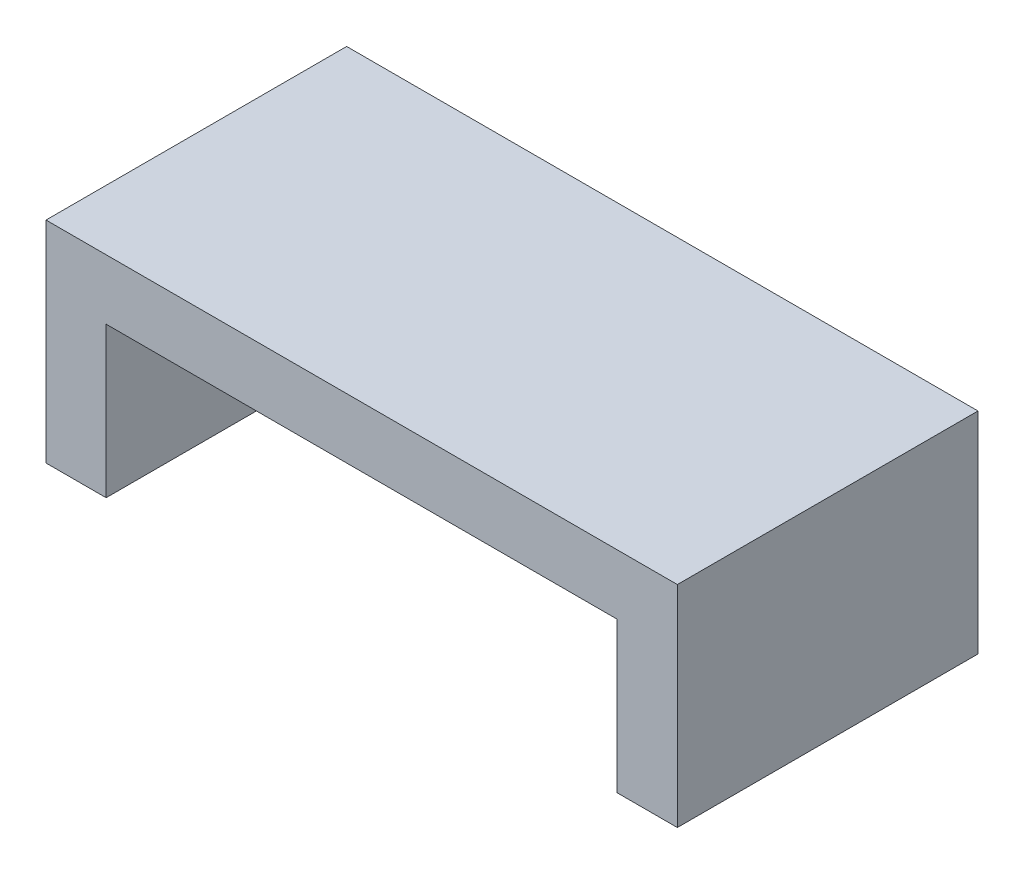
ISO-10303-21;
HEADER;
FILE_DESCRIPTION(('STEP AP214'),'2;1');
FILE_NAME('part.step','',(''),(''),'','','');
FILE_SCHEMA(('AUTOMOTIVE_DESIGN { 1 0 10303 214 1 1 1 1 }'));
ENDSEC;
DATA;
#1=APPLICATION_CONTEXT('core data for automotive mechanical design processes');
#2=APPLICATION_PROTOCOL_DEFINITION('international standard','automotive_design',2000,#1);
#3=PRODUCT_CONTEXT('',#1,'mechanical');
#4=PRODUCT('Part','Part','',(#3));
#5=PRODUCT_RELATED_PRODUCT_CATEGORY('part','',(#4));
#6=PRODUCT_DEFINITION_FORMATION('','',#4);
#7=PRODUCT_DEFINITION_CONTEXT('part definition',#1,'design');
#8=PRODUCT_DEFINITION('design','',#6,#7);
#9=PRODUCT_DEFINITION_SHAPE('','',#8);
#10=(LENGTH_UNIT() NAMED_UNIT(*) SI_UNIT(.MILLI.,.METRE.));
#11=(NAMED_UNIT(*) PLANE_ANGLE_UNIT() SI_UNIT($,.RADIAN.));
#12=(NAMED_UNIT(*) SI_UNIT($,.STERADIAN.) SOLID_ANGLE_UNIT());
#13=UNCERTAINTY_MEASURE_WITH_UNIT(LENGTH_MEASURE(1.E-05),#10,'distance_accuracy_value','');
#14=(GEOMETRIC_REPRESENTATION_CONTEXT(3) GLOBAL_UNCERTAINTY_ASSIGNED_CONTEXT((#13)) GLOBAL_UNIT_ASSIGNED_CONTEXT((#10,
#11,#12)) REPRESENTATION_CONTEXT('',''));
#15=CARTESIAN_POINT('',(0.,0.,0.));
#16=DIRECTION('',(0.,0.,1.));
#17=DIRECTION('',(1.,0.,0.));
#18=AXIS2_PLACEMENT_3D('',#15,#16,#17);
#19=CARTESIAN_POINT('',(0.,0.,0.));
#20=DIRECTION('',(0.,1.,0.));
#21=DIRECTION('',(0.,0.,1.));
#22=AXIS2_PLACEMENT_3D('',#19,#20,#21);
#23=PLANE('',#22);
#24=DIRECTION('',(-1.,0.,0.));
#25=VECTOR('',#24,1.);
#26=CARTESIAN_POINT('',(-7.74008976830073,0.,-6.1198224852071));
#27=LINE('',#26,#25);
#28=CARTESIAN_POINT('',(-5.74008976830073,0.,-6.1198224852071));
#29=VERTEX_POINT('',#28);
#30=CARTESIAN_POINT('',(-7.74008976830073,0.,-6.1198224852071));
#31=VERTEX_POINT('',#30);
#32=EDGE_CURVE('E85',#29,#31,#27,.T.);
#33=ORIENTED_EDGE('',*,*,#32,.F.);
#34=DIRECTION('',(0.,0.,1.));
#35=VECTOR('',#34,1.);
#36=CARTESIAN_POINT('',(-5.74008976830073,0.,-23.8398676318764));
#37=LINE('',#36,#35);
#38=CARTESIAN_POINT('',(-5.74008976830073,0.,3.8801775147929));
#39=VERTEX_POINT('',#38);
#40=EDGE_CURVE('E117',#29,#39,#37,.T.);
#41=ORIENTED_EDGE('',*,*,#40,.T.);
#42=DIRECTION('',(1.,0.,0.));
#43=VECTOR('',#42,1.);
#44=CARTESIAN_POINT('',(-7.74008976830073,0.,3.8801775147929));
#45=LINE('',#44,#43);
#46=CARTESIAN_POINT('',(-7.74008976830073,0.,3.8801775147929));
#47=VERTEX_POINT('',#46);
#48=EDGE_CURVE('E128',#47,#39,#45,.T.);
#49=ORIENTED_EDGE('',*,*,#48,.F.);
#50=DIRECTION('',(0.,0.,1.));
#51=VECTOR('',#50,1.);
#52=CARTESIAN_POINT('',(-7.74008976830073,0.,-6.1198224852071));
#53=LINE('',#52,#51);
#54=EDGE_CURVE('E143',#31,#47,#53,.T.);
#55=ORIENTED_EDGE('',*,*,#54,.F.);
#56=EDGE_LOOP('',(#33,#41,#49,#55));
#57=FACE_BOUND('',#56,.T.);
#58=ADVANCED_FACE('F39',(#57),#23,.F.);
#59=CARTESIAN_POINT('',(-7.74008976830073,7.,-6.1198224852071));
#60=DIRECTION('',(1.,0.,0.));
#61=DIRECTION('',(0.,0.,-1.));
#62=AXIS2_PLACEMENT_3D('',#59,#60,#61);
#63=PLANE('',#62);
#64=ORIENTED_EDGE('',*,*,#54,.T.);
#65=DIRECTION('',(0.,-1.,0.));
#66=VECTOR('',#65,1.);
#67=CARTESIAN_POINT('',(-7.74008976830073,7.,3.8801775147929));
#68=LINE('',#67,#66);
#69=CARTESIAN_POINT('',(-7.74008976830073,7.,3.8801775147929));
#70=VERTEX_POINT('',#69);
#71=EDGE_CURVE('E11',#70,#47,#68,.T.);
#72=ORIENTED_EDGE('',*,*,#71,.F.);
#73=DIRECTION('',(0.,0.,1.));
#74=VECTOR('',#73,1.);
#75=CARTESIAN_POINT('',(-7.74008976830073,7.,-6.1198224852071));
#76=LINE('',#75,#74);
#77=CARTESIAN_POINT('',(-7.74008976830073,7.,-6.1198224852071));
#78=VERTEX_POINT('',#77);
#79=EDGE_CURVE('E151',#78,#70,#76,.T.);
#80=ORIENTED_EDGE('',*,*,#79,.F.);
#81=DIRECTION('',(0.,-1.,0.));
#82=VECTOR('',#81,1.);
#83=CARTESIAN_POINT('',(-7.74008976830073,7.,-6.1198224852071));
#84=LINE('',#83,#82);
#85=EDGE_CURVE('E152',#78,#31,#84,.T.);
#86=ORIENTED_EDGE('',*,*,#85,.T.);
#87=EDGE_LOOP('',(#64,#72,#80,#86));
#88=FACE_BOUND('',#87,.T.);
#89=ADVANCED_FACE('F41',(#88),#63,.F.);
#90=CARTESIAN_POINT('',(-7.74008976830073,7.,3.8801775147929));
#91=DIRECTION('',(0.,0.,-1.));
#92=DIRECTION('',(-1.,0.,0.));
#93=AXIS2_PLACEMENT_3D('',#90,#91,#92);
#94=PLANE('',#93);
#95=ORIENTED_EDGE('',*,*,#48,.T.);
#96=DIRECTION('',(0.,-1.,0.));
#97=VECTOR('',#96,1.);
#98=CARTESIAN_POINT('',(-5.74008976830073,5.,3.8801775147929));
#99=LINE('',#98,#97);
#100=CARTESIAN_POINT('',(-5.74008976830073,5.,3.8801775147929));
#101=VERTEX_POINT('',#100);
#102=EDGE_CURVE('E114',#101,#39,#99,.T.);
#103=ORIENTED_EDGE('',*,*,#102,.F.);
#104=DIRECTION('',(-1.,0.,0.));
#105=VECTOR('',#104,1.);
#106=CARTESIAN_POINT('',(-5.74008976830073,5.,3.8801775147929));
#107=LINE('',#106,#105);
#108=CARTESIAN_POINT('',(11.2599102316993,5.,3.8801775147929));
#109=VERTEX_POINT('',#108);
#110=EDGE_CURVE('E131',#109,#101,#107,.T.);
#111=ORIENTED_EDGE('',*,*,#110,.F.);
#112=DIRECTION('',(0.,1.,0.));
#113=VECTOR('',#112,1.);
#114=CARTESIAN_POINT('',(11.2599102316993,5.,3.8801775147929));
#115=LINE('',#114,#113);
#116=CARTESIAN_POINT('',(11.2599102316993,0.,3.8801775147929));
#117=VERTEX_POINT('',#116);
#118=EDGE_CURVE('E124',#117,#109,#115,.T.);
#119=ORIENTED_EDGE('',*,*,#118,.F.);
#120=CARTESIAN_POINT('',(13.2599102316993,0.,3.8801775147929));
#121=VERTEX_POINT('',#120);
#122=EDGE_CURVE('E138',#117,#121,#45,.T.);
#123=ORIENTED_EDGE('',*,*,#122,.T.);
#124=DIRECTION('',(0.,-1.,0.));
#125=VECTOR('',#124,1.);
#126=CARTESIAN_POINT('',(13.2599102316993,7.,3.8801775147929));
#127=LINE('',#126,#125);
#128=CARTESIAN_POINT('',(13.2599102316993,7.,3.8801775147929));
#129=VERTEX_POINT('',#128);
#130=EDGE_CURVE('E48',#129,#121,#127,.T.);
#131=ORIENTED_EDGE('',*,*,#130,.F.);
#132=DIRECTION('',(1.,0.,0.));
#133=VECTOR('',#132,1.);
#134=CARTESIAN_POINT('',(-7.74008976830073,7.,3.8801775147929));
#135=LINE('',#134,#133);
#136=EDGE_CURVE('E92',#70,#129,#135,.T.);
#137=ORIENTED_EDGE('',*,*,#136,.F.);
#138=ORIENTED_EDGE('',*,*,#71,.T.);
#139=EDGE_LOOP('',(#95,#103,#111,#119,#123,#131,#137,#138));
#140=FACE_BOUND('',#139,.T.);
#141=ADVANCED_FACE('F133',(#140),#94,.F.);
#142=CARTESIAN_POINT('',(13.2599102316993,7.,-6.1198224852071));
#143=DIRECTION('',(-1.,0.,0.));
#144=DIRECTION('',(0.,0.,1.));
#145=AXIS2_PLACEMENT_3D('',#142,#143,#144);
#146=PLANE('',#145);
#147=DIRECTION('',(0.,0.,-1.));
#148=VECTOR('',#147,1.);
#149=CARTESIAN_POINT('',(13.2599102316993,0.,-6.1198224852071));
#150=LINE('',#149,#148);
#151=CARTESIAN_POINT('',(13.2599102316993,0.,-6.1198224852071));
#152=VERTEX_POINT('',#151);
#153=EDGE_CURVE('E137',#121,#152,#150,.T.);
#154=ORIENTED_EDGE('',*,*,#153,.T.);
#155=DIRECTION('',(0.,-1.,0.));
#156=VECTOR('',#155,1.);
#157=CARTESIAN_POINT('',(13.2599102316993,7.,-6.1198224852071));
#158=LINE('',#157,#156);
#159=CARTESIAN_POINT('',(13.2599102316993,7.,-6.1198224852071));
#160=VERTEX_POINT('',#159);
#161=EDGE_CURVE('E155',#160,#152,#158,.T.);
#162=ORIENTED_EDGE('',*,*,#161,.F.);
#163=DIRECTION('',(0.,0.,-1.));
#164=VECTOR('',#163,1.);
#165=CARTESIAN_POINT('',(13.2599102316993,7.,-6.1198224852071));
#166=LINE('',#165,#164);
#167=EDGE_CURVE('E165',#129,#160,#166,.T.);
#168=ORIENTED_EDGE('',*,*,#167,.F.);
#169=ORIENTED_EDGE('',*,*,#130,.T.);
#170=EDGE_LOOP('',(#154,#162,#168,#169));
#171=FACE_BOUND('',#170,.T.);
#172=ADVANCED_FACE('F163',(#171),#146,.F.);
#173=CARTESIAN_POINT('',(-7.74008976830073,7.,-6.1198224852071));
#174=DIRECTION('',(0.,0.,1.));
#175=DIRECTION('',(1.,0.,0.));
#176=AXIS2_PLACEMENT_3D('',#173,#174,#175);
#177=PLANE('',#176);
#178=DIRECTION('',(1.,0.,0.));
#179=VECTOR('',#178,1.);
#180=CARTESIAN_POINT('',(-5.74008976830073,5.,-6.1198224852071));
#181=LINE('',#180,#179);
#182=CARTESIAN_POINT('',(-5.74008976830073,5.,-6.1198224852071));
#183=VERTEX_POINT('',#182);
#184=CARTESIAN_POINT('',(11.2599102316993,5.,-6.1198224852071));
#185=VERTEX_POINT('',#184);
#186=EDGE_CURVE('E196',#183,#185,#181,.T.);
#187=ORIENTED_EDGE('',*,*,#186,.F.);
#188=DIRECTION('',(0.,1.,0.));
#189=VECTOR('',#188,1.);
#190=CARTESIAN_POINT('',(-5.74008976830073,5.,-6.1198224852071));
#191=LINE('',#190,#189);
#192=EDGE_CURVE('E193',#29,#183,#191,.T.);
#193=ORIENTED_EDGE('',*,*,#192,.F.);
#194=ORIENTED_EDGE('',*,*,#32,.T.);
#195=ORIENTED_EDGE('',*,*,#85,.F.);
#196=DIRECTION('',(-1.,0.,0.));
#197=VECTOR('',#196,1.);
#198=CARTESIAN_POINT('',(-7.74008976830073,7.,-6.1198224852071));
#199=LINE('',#198,#197);
#200=EDGE_CURVE('E64',#160,#78,#199,.T.);
#201=ORIENTED_EDGE('',*,*,#200,.F.);
#202=ORIENTED_EDGE('',*,*,#161,.T.);
#203=CARTESIAN_POINT('',(11.2599102316993,0.,-6.1198224852071));
#204=VERTEX_POINT('',#203);
#205=EDGE_CURVE('E147',#152,#204,#27,.T.);
#206=ORIENTED_EDGE('',*,*,#205,.T.);
#207=DIRECTION('',(0.,-1.,0.));
#208=VECTOR('',#207,1.);
#209=CARTESIAN_POINT('',(11.2599102316993,5.,-6.1198224852071));
#210=LINE('',#209,#208);
#211=EDGE_CURVE('E55',#185,#204,#210,.T.);
#212=ORIENTED_EDGE('',*,*,#211,.F.);
#213=EDGE_LOOP('',(#187,#193,#194,#195,#201,#202,#206,#212));
#214=FACE_BOUND('',#213,.T.);
#215=ADVANCED_FACE('F171',(#214),#177,.F.);
#216=CARTESIAN_POINT('',(0.,7.,0.));
#217=DIRECTION('',(0.,1.,0.));
#218=DIRECTION('',(0.,0.,1.));
#219=AXIS2_PLACEMENT_3D('',#216,#217,#218);
#220=PLANE('',#219);
#221=ORIENTED_EDGE('',*,*,#79,.T.);
#222=ORIENTED_EDGE('',*,*,#136,.T.);
#223=ORIENTED_EDGE('',*,*,#167,.T.);
#224=ORIENTED_EDGE('',*,*,#200,.T.);
#225=EDGE_LOOP('',(#221,#222,#223,#224));
#226=FACE_BOUND('',#225,.T.);
#227=ADVANCED_FACE('F202',(#226),#220,.T.);
#228=ORIENTED_EDGE('',*,*,#122,.F.);
#229=DIRECTION('',(0.,0.,1.));
#230=VECTOR('',#229,1.);
#231=CARTESIAN_POINT('',(11.2599102316993,0.,-23.8398676318764));
#232=LINE('',#231,#230);
#233=EDGE_CURVE('E130',#204,#117,#232,.T.);
#234=ORIENTED_EDGE('',*,*,#233,.F.);
#235=ORIENTED_EDGE('',*,*,#205,.F.);
#236=ORIENTED_EDGE('',*,*,#153,.F.);
#237=EDGE_LOOP('',(#228,#234,#235,#236));
#238=FACE_BOUND('',#237,.T.);
#239=ADVANCED_FACE('F169',(#238),#23,.F.);
#240=CARTESIAN_POINT('',(-5.74008976830073,5.,-23.8398676318764));
#241=DIRECTION('',(-1.,0.,0.));
#242=DIRECTION('',(0.,-1.,0.));
#243=AXIS2_PLACEMENT_3D('',#240,#241,#242);
#244=PLANE('',#243);
#245=ORIENTED_EDGE('',*,*,#192,.T.);
#246=DIRECTION('',(0.,0.,1.));
#247=VECTOR('',#246,1.);
#248=CARTESIAN_POINT('',(-5.74008976830073,5.,-23.8398676318764));
#249=LINE('',#248,#247);
#250=EDGE_CURVE('E119',#183,#101,#249,.T.);
#251=ORIENTED_EDGE('',*,*,#250,.T.);
#252=ORIENTED_EDGE('',*,*,#102,.T.);
#253=ORIENTED_EDGE('',*,*,#40,.F.);
#254=EDGE_LOOP('',(#245,#251,#252,#253));
#255=FACE_BOUND('',#254,.T.);
#256=ADVANCED_FACE('F116',(#255),#244,.F.);
#257=CARTESIAN_POINT('',(-5.74008976830073,5.,-23.8398676318764));
#258=DIRECTION('',(0.,1.,0.));
#259=DIRECTION('',(0.,0.,1.));
#260=AXIS2_PLACEMENT_3D('',#257,#258,#259);
#261=PLANE('',#260);
#262=ORIENTED_EDGE('',*,*,#186,.T.);
#263=DIRECTION('',(0.,0.,1.));
#264=VECTOR('',#263,1.);
#265=CARTESIAN_POINT('',(11.2599102316993,5.,-23.8398676318764));
#266=LINE('',#265,#264);
#267=EDGE_CURVE('E183',#185,#109,#266,.T.);
#268=ORIENTED_EDGE('',*,*,#267,.T.);
#269=ORIENTED_EDGE('',*,*,#110,.T.);
#270=ORIENTED_EDGE('',*,*,#250,.F.);
#271=EDGE_LOOP('',(#262,#268,#269,#270));
#272=FACE_BOUND('',#271,.T.);
#273=ADVANCED_FACE('F248',(#272),#261,.F.);
#274=CARTESIAN_POINT('',(11.2599102316993,5.,-23.8398676318764));
#275=DIRECTION('',(1.,0.,0.));
#276=DIRECTION('',(0.,1.,0.));
#277=AXIS2_PLACEMENT_3D('',#274,#275,#276);
#278=PLANE('',#277);
#279=ORIENTED_EDGE('',*,*,#211,.T.);
#280=ORIENTED_EDGE('',*,*,#233,.T.);
#281=ORIENTED_EDGE('',*,*,#118,.T.);
#282=ORIENTED_EDGE('',*,*,#267,.F.);
#283=EDGE_LOOP('',(#279,#280,#281,#282));
#284=FACE_BOUND('',#283,.T.);
#285=ADVANCED_FACE('F256',(#284),#278,.F.);
#286=CLOSED_SHELL('',(#58,#89,#141,#172,#215,#227,#239,#256,#273,#285));
#287=MANIFOLD_SOLID_BREP('B2',#286);
#288=ADVANCED_BREP_SHAPE_REPRESENTATION('',(#18,#287),#14);
#289=SHAPE_DEFINITION_REPRESENTATION(#9,#288);
ENDSEC;
END-ISO-10303-21;
